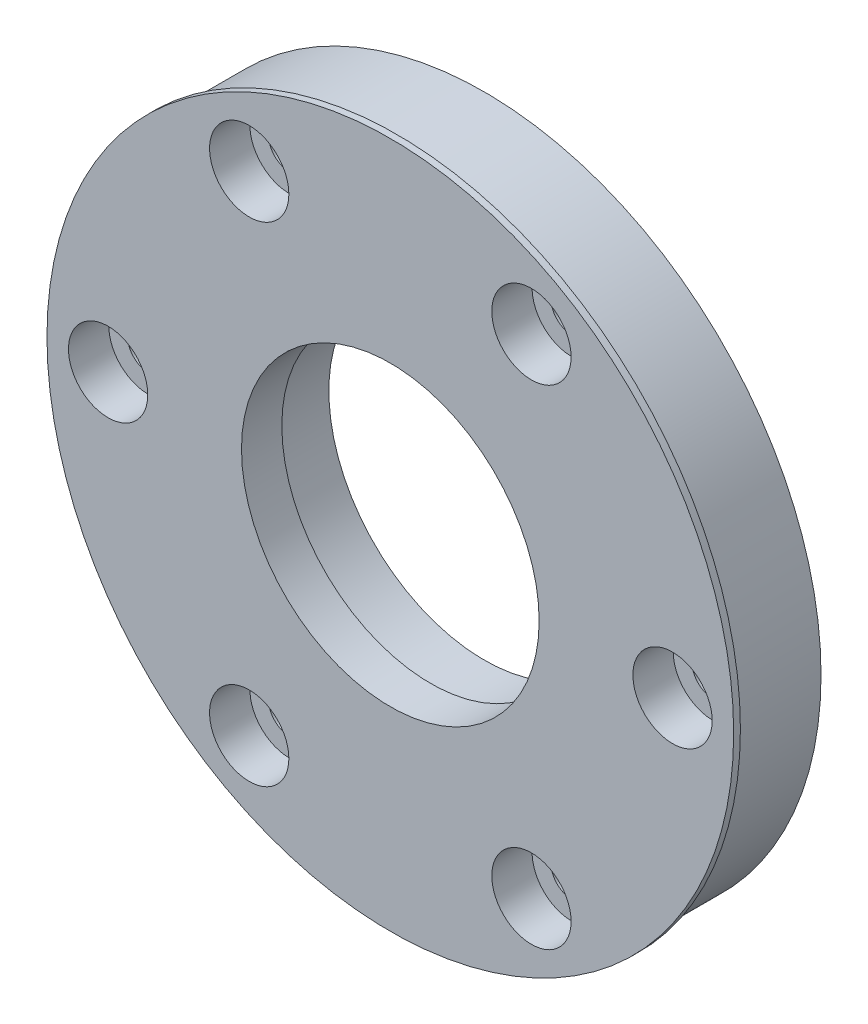
ISO-10303-21;
HEADER;
FILE_DESCRIPTION(('STEP AP214'),'2;1');
FILE_NAME('part.step','',(''),(''),'','','');
FILE_SCHEMA(('AUTOMOTIVE_DESIGN { 1 0 10303 214 1 1 1 1 }'));
ENDSEC;
DATA;
#1=APPLICATION_CONTEXT('core data for automotive mechanical design processes');
#2=APPLICATION_PROTOCOL_DEFINITION('international standard','automotive_design',2000,#1);
#3=PRODUCT_CONTEXT('',#1,'mechanical');
#4=PRODUCT('Part','Part','',(#3));
#5=PRODUCT_RELATED_PRODUCT_CATEGORY('part','',(#4));
#6=PRODUCT_DEFINITION_FORMATION('','',#4);
#7=PRODUCT_DEFINITION_CONTEXT('part definition',#1,'design');
#8=PRODUCT_DEFINITION('design','',#6,#7);
#9=PRODUCT_DEFINITION_SHAPE('','',#8);
#10=(LENGTH_UNIT() NAMED_UNIT(*) SI_UNIT(.MILLI.,.METRE.));
#11=(NAMED_UNIT(*) PLANE_ANGLE_UNIT() SI_UNIT($,.RADIAN.));
#12=(NAMED_UNIT(*) SI_UNIT($,.STERADIAN.) SOLID_ANGLE_UNIT());
#13=UNCERTAINTY_MEASURE_WITH_UNIT(LENGTH_MEASURE(1.E-05),#10,'distance_accuracy_value','');
#14=(GEOMETRIC_REPRESENTATION_CONTEXT(3) GLOBAL_UNCERTAINTY_ASSIGNED_CONTEXT((#13)) GLOBAL_UNIT_ASSIGNED_CONTEXT((#10,
#11,#12)) REPRESENTATION_CONTEXT('',''));
#15=CARTESIAN_POINT('',(0.,0.,0.));
#16=DIRECTION('',(0.,0.,1.));
#17=DIRECTION('',(1.,0.,0.));
#18=AXIS2_PLACEMENT_3D('',#15,#16,#17);
#19=CARTESIAN_POINT('',(0.,0.,0.));
#20=DIRECTION('',(0.,0.,1.));
#21=DIRECTION('',(1.,0.,0.));
#22=AXIS2_PLACEMENT_3D('',#19,#20,#21);
#23=CYLINDRICAL_SURFACE('',#22,11.575);
#24=CARTESIAN_POINT('',(0.,0.,0.));
#25=DIRECTION('',(0.,0.,1.));
#26=DIRECTION('',(1.,0.,0.));
#27=AXIS2_PLACEMENT_3D('',#24,#25,#26);
#28=CIRCLE('',#27,11.575);
#29=CARTESIAN_POINT('',(11.575,0.,0.));
#30=VERTEX_POINT('',#29);
#31=EDGE_CURVE('E200',#30,#30,#28,.T.);
#32=ORIENTED_EDGE('',*,*,#31,.F.);
#33=EDGE_LOOP('',(#32));
#34=FACE_BOUND('',#33,.T.);
#35=CARTESIAN_POINT('',(0.,0.,4.));
#36=DIRECTION('',(0.,0.,1.));
#37=DIRECTION('',(1.,0.,0.));
#38=AXIS2_PLACEMENT_3D('',#35,#36,#37);
#39=CIRCLE('',#38,11.575);
#40=CARTESIAN_POINT('',(11.575,0.,4.));
#41=VERTEX_POINT('',#40);
#42=EDGE_CURVE('E10',#41,#41,#39,.F.);
#43=ORIENTED_EDGE('',*,*,#42,.F.);
#44=EDGE_LOOP('',(#43));
#45=FACE_BOUND('',#44,.T.);
#46=ADVANCED_FACE('F43',(#34,#45),#23,.F.);
#47=CARTESIAN_POINT('',(10.5,18.1865334794732,7.));
#48=DIRECTION('',(0.,0.,-1.));
#49=DIRECTION('',(-1.,0.,0.));
#50=AXIS2_PLACEMENT_3D('',#47,#48,#49);
#51=CYLINDRICAL_SURFACE('',#50,1.55);
#52=CARTESIAN_POINT('',(10.5,18.1865334794732,4.));
#53=DIRECTION('',(0.,0.,1.));
#54=DIRECTION('',(1.,0.,0.));
#55=AXIS2_PLACEMENT_3D('',#52,#53,#54);
#56=CIRCLE('',#55,1.55);
#57=CARTESIAN_POINT('',(12.05,18.1865334794732,4.));
#58=VERTEX_POINT('',#57);
#59=EDGE_CURVE('E90',#58,#58,#56,.T.);
#60=ORIENTED_EDGE('',*,*,#59,.T.);
#61=EDGE_LOOP('',(#60));
#62=FACE_BOUND('',#61,.T.);
#63=CARTESIAN_POINT('',(10.5,18.1865334794732,1.7));
#64=DIRECTION('',(0.,0.,-1.));
#65=DIRECTION('',(-1.,0.,0.));
#66=AXIS2_PLACEMENT_3D('',#63,#64,#65);
#67=CIRCLE('',#66,1.55);
#68=CARTESIAN_POINT('',(8.95000000000001,18.1865334794732,1.7));
#69=VERTEX_POINT('',#68);
#70=EDGE_CURVE('E88',#69,#69,#67,.F.);
#71=ORIENTED_EDGE('',*,*,#70,.F.);
#72=EDGE_LOOP('',(#71));
#73=FACE_BOUND('',#72,.T.);
#74=ADVANCED_FACE('F265',(#62,#73),#51,.F.);
#75=CARTESIAN_POINT('',(-10.5,18.1865334794732,7.));
#76=DIRECTION('',(0.,0.,-1.));
#77=DIRECTION('',(-1.,0.,0.));
#78=AXIS2_PLACEMENT_3D('',#75,#76,#77);
#79=CYLINDRICAL_SURFACE('',#78,1.55);
#80=CARTESIAN_POINT('',(-10.5,18.1865334794732,4.));
#81=DIRECTION('',(0.,0.,1.));
#82=DIRECTION('',(1.,0.,0.));
#83=AXIS2_PLACEMENT_3D('',#80,#81,#82);
#84=CIRCLE('',#83,1.55);
#85=CARTESIAN_POINT('',(-8.95,18.1865334794732,4.));
#86=VERTEX_POINT('',#85);
#87=EDGE_CURVE('E94',#86,#86,#84,.T.);
#88=ORIENTED_EDGE('',*,*,#87,.T.);
#89=EDGE_LOOP('',(#88));
#90=FACE_BOUND('',#89,.T.);
#91=CARTESIAN_POINT('',(-10.5,18.1865334794732,1.7));
#92=DIRECTION('',(0.,0.,-1.));
#93=DIRECTION('',(-1.,0.,0.));
#94=AXIS2_PLACEMENT_3D('',#91,#92,#93);
#95=CIRCLE('',#94,1.55);
#96=CARTESIAN_POINT('',(-12.05,18.1865334794732,1.7));
#97=VERTEX_POINT('',#96);
#98=EDGE_CURVE('E86',#97,#97,#95,.F.);
#99=ORIENTED_EDGE('',*,*,#98,.F.);
#100=EDGE_LOOP('',(#99));
#101=FACE_BOUND('',#100,.T.);
#102=ADVANCED_FACE('F273',(#90,#101),#79,.F.);
#103=CARTESIAN_POINT('',(-21.,0.,7.));
#104=DIRECTION('',(0.,0.,-1.));
#105=DIRECTION('',(-1.,0.,0.));
#106=AXIS2_PLACEMENT_3D('',#103,#104,#105);
#107=CYLINDRICAL_SURFACE('',#106,1.55);
#108=CARTESIAN_POINT('',(-21.,0.,4.));
#109=DIRECTION('',(0.,0.,1.));
#110=DIRECTION('',(1.,0.,0.));
#111=AXIS2_PLACEMENT_3D('',#108,#109,#110);
#112=CIRCLE('',#111,1.55);
#113=CARTESIAN_POINT('',(-19.45,0.,4.));
#114=VERTEX_POINT('',#113);
#115=EDGE_CURVE('E99',#114,#114,#112,.T.);
#116=ORIENTED_EDGE('',*,*,#115,.T.);
#117=EDGE_LOOP('',(#116));
#118=FACE_BOUND('',#117,.T.);
#119=CARTESIAN_POINT('',(-21.,0.,1.7));
#120=DIRECTION('',(0.,0.,-1.));
#121=DIRECTION('',(-1.,0.,0.));
#122=AXIS2_PLACEMENT_3D('',#119,#120,#121);
#123=CIRCLE('',#122,1.55);
#124=CARTESIAN_POINT('',(-22.55,0.,1.7));
#125=VERTEX_POINT('',#124);
#126=EDGE_CURVE('E82',#125,#125,#123,.F.);
#127=ORIENTED_EDGE('',*,*,#126,.F.);
#128=EDGE_LOOP('',(#127));
#129=FACE_BOUND('',#128,.T.);
#130=ADVANCED_FACE('F414',(#118,#129),#107,.F.);
#131=CARTESIAN_POINT('',(-10.5,-18.1865334794732,7.));
#132=DIRECTION('',(0.,0.,-1.));
#133=DIRECTION('',(-1.,0.,0.));
#134=AXIS2_PLACEMENT_3D('',#131,#132,#133);
#135=CYLINDRICAL_SURFACE('',#134,1.55);
#136=CARTESIAN_POINT('',(-10.5,-18.1865334794732,4.));
#137=DIRECTION('',(0.,0.,1.));
#138=DIRECTION('',(1.,0.,0.));
#139=AXIS2_PLACEMENT_3D('',#136,#137,#138);
#140=CIRCLE('',#139,1.55);
#141=CARTESIAN_POINT('',(-8.95000000000001,-18.1865334794732,4.));
#142=VERTEX_POINT('',#141);
#143=EDGE_CURVE('E108',#142,#142,#140,.T.);
#144=ORIENTED_EDGE('',*,*,#143,.T.);
#145=EDGE_LOOP('',(#144));
#146=FACE_BOUND('',#145,.T.);
#147=CARTESIAN_POINT('',(-10.5,-18.1865334794732,1.7));
#148=DIRECTION('',(0.,0.,-1.));
#149=DIRECTION('',(-1.,0.,0.));
#150=AXIS2_PLACEMENT_3D('',#147,#148,#149);
#151=CIRCLE('',#150,1.55);
#152=CARTESIAN_POINT('',(-12.05,-18.1865334794732,1.7));
#153=VERTEX_POINT('',#152);
#154=EDGE_CURVE('E79',#153,#153,#151,.F.);
#155=ORIENTED_EDGE('',*,*,#154,.F.);
#156=EDGE_LOOP('',(#155));
#157=FACE_BOUND('',#156,.T.);
#158=ADVANCED_FACE('F422',(#146,#157),#135,.F.);
#159=CARTESIAN_POINT('',(10.5,-18.1865334794732,7.));
#160=DIRECTION('',(0.,0.,-1.));
#161=DIRECTION('',(-1.,0.,0.));
#162=AXIS2_PLACEMENT_3D('',#159,#160,#161);
#163=CYLINDRICAL_SURFACE('',#162,1.55);
#164=CARTESIAN_POINT('',(10.5,-18.1865334794732,4.));
#165=DIRECTION('',(0.,0.,1.));
#166=DIRECTION('',(1.,0.,0.));
#167=AXIS2_PLACEMENT_3D('',#164,#165,#166);
#168=CIRCLE('',#167,1.55);
#169=CARTESIAN_POINT('',(12.05,-18.1865334794732,4.));
#170=VERTEX_POINT('',#169);
#171=EDGE_CURVE('E111',#170,#170,#168,.T.);
#172=ORIENTED_EDGE('',*,*,#171,.T.);
#173=EDGE_LOOP('',(#172));
#174=FACE_BOUND('',#173,.T.);
#175=CARTESIAN_POINT('',(10.5,-18.1865334794732,1.7));
#176=DIRECTION('',(0.,0.,-1.));
#177=DIRECTION('',(-1.,0.,0.));
#178=AXIS2_PLACEMENT_3D('',#175,#176,#177);
#179=CIRCLE('',#178,1.55);
#180=CARTESIAN_POINT('',(8.94999999999999,-18.1865334794732,1.7));
#181=VERTEX_POINT('',#180);
#182=EDGE_CURVE('E74',#181,#181,#179,.F.);
#183=ORIENTED_EDGE('',*,*,#182,.F.);
#184=EDGE_LOOP('',(#183));
#185=FACE_BOUND('',#184,.T.);
#186=ADVANCED_FACE('F430',(#174,#185),#163,.F.);
#187=CARTESIAN_POINT('',(21.,0.,7.));
#188=DIRECTION('',(0.,0.,-1.));
#189=DIRECTION('',(-1.,0.,0.));
#190=AXIS2_PLACEMENT_3D('',#187,#188,#189);
#191=CYLINDRICAL_SURFACE('',#190,1.55);
#192=CARTESIAN_POINT('',(21.,0.,4.));
#193=DIRECTION('',(0.,0.,1.));
#194=DIRECTION('',(1.,0.,0.));
#195=AXIS2_PLACEMENT_3D('',#192,#193,#194);
#196=CIRCLE('',#195,1.55);
#197=CARTESIAN_POINT('',(22.55,0.,4.));
#198=VERTEX_POINT('',#197);
#199=EDGE_CURVE('E115',#198,#198,#196,.T.);
#200=ORIENTED_EDGE('',*,*,#199,.T.);
#201=EDGE_LOOP('',(#200));
#202=FACE_BOUND('',#201,.T.);
#203=CARTESIAN_POINT('',(21.,0.,1.7));
#204=DIRECTION('',(0.,0.,-1.));
#205=DIRECTION('',(-1.,0.,0.));
#206=AXIS2_PLACEMENT_3D('',#203,#204,#205);
#207=CIRCLE('',#206,1.55);
#208=CARTESIAN_POINT('',(19.45,0.,1.7));
#209=VERTEX_POINT('',#208);
#210=EDGE_CURVE('E70',#209,#209,#207,.F.);
#211=ORIENTED_EDGE('',*,*,#210,.F.);
#212=EDGE_LOOP('',(#211));
#213=FACE_BOUND('',#212,.T.);
#214=ADVANCED_FACE('F181',(#202,#213),#191,.F.);
#215=CARTESIAN_POINT('',(0.,0.,7.));
#216=DIRECTION('',(0.,0.,1.));
#217=DIRECTION('',(1.,0.,0.));
#218=AXIS2_PLACEMENT_3D('',#215,#216,#217);
#219=PLANE('',#218);
#220=CARTESIAN_POINT('',(-21.,1.46638343828664E-13,7.));
#221=DIRECTION('',(0.,0.,1.));
#222=DIRECTION('',(1.,0.,0.));
#223=AXIS2_PLACEMENT_3D('',#220,#221,#222);
#224=CIRCLE('',#223,2.95);
#225=CARTESIAN_POINT('',(-18.05,1.46638343828664E-13,7.));
#226=VERTEX_POINT('',#225);
#227=EDGE_CURVE('E129',#226,#226,#224,.T.);
#228=ORIENTED_EDGE('',*,*,#227,.F.);
#229=EDGE_LOOP('',(#228));
#230=FACE_BOUND('',#229,.T.);
#231=CARTESIAN_POINT('',(-10.5000000000003,-18.186533479473,7.));
#232=DIRECTION('',(0.,0.,1.));
#233=DIRECTION('',(1.,0.,0.));
#234=AXIS2_PLACEMENT_3D('',#231,#232,#233);
#235=CIRCLE('',#234,2.95);
#236=CARTESIAN_POINT('',(-7.55000000000034,-18.186533479473,7.));
#237=VERTEX_POINT('',#236);
#238=EDGE_CURVE('E134',#237,#237,#235,.T.);
#239=ORIENTED_EDGE('',*,*,#238,.F.);
#240=EDGE_LOOP('',(#239));
#241=FACE_BOUND('',#240,.T.);
#242=CARTESIAN_POINT('',(10.5000000000001,-18.1865334794728,7.));
#243=DIRECTION('',(0.,0.,1.));
#244=DIRECTION('',(1.,0.,0.));
#245=AXIS2_PLACEMENT_3D('',#242,#243,#244);
#246=CIRCLE('',#245,2.95);
#247=CARTESIAN_POINT('',(13.4500000000001,-18.1865334794728,7.));
#248=VERTEX_POINT('',#247);
#249=EDGE_CURVE('E161',#248,#248,#246,.T.);
#250=ORIENTED_EDGE('',*,*,#249,.F.);
#251=EDGE_LOOP('',(#250));
#252=FACE_BOUND('',#251,.T.);
#253=CARTESIAN_POINT('',(21.,-1.44066585550455E-13,7.));
#254=DIRECTION('',(0.,0.,1.));
#255=DIRECTION('',(1.,0.,0.));
#256=AXIS2_PLACEMENT_3D('',#253,#254,#255);
#257=CIRCLE('',#256,2.95);
#258=CARTESIAN_POINT('',(23.95,-1.44066585550455E-13,7.));
#259=VERTEX_POINT('',#258);
#260=EDGE_CURVE('E153',#259,#259,#257,.T.);
#261=ORIENTED_EDGE('',*,*,#260,.F.);
#262=EDGE_LOOP('',(#261));
#263=FACE_BOUND('',#262,.T.);
#264=CARTESIAN_POINT('',(10.4999999999999,18.1865334794736,7.));
#265=DIRECTION('',(0.,0.,1.));
#266=DIRECTION('',(1.,0.,0.));
#267=AXIS2_PLACEMENT_3D('',#264,#265,#266);
#268=CIRCLE('',#267,2.95);
#269=CARTESIAN_POINT('',(13.4499999999999,18.1865334794736,7.));
#270=VERTEX_POINT('',#269);
#271=EDGE_CURVE('E147',#270,#270,#268,.T.);
#272=ORIENTED_EDGE('',*,*,#271,.F.);
#273=EDGE_LOOP('',(#272));
#274=FACE_BOUND('',#273,.T.);
#275=CARTESIAN_POINT('',(-10.4999999999998,18.1865334794733,7.));
#276=DIRECTION('',(0.,0.,1.));
#277=DIRECTION('',(1.,0.,0.));
#278=AXIS2_PLACEMENT_3D('',#275,#276,#277);
#279=CIRCLE('',#278,2.95);
#280=CARTESIAN_POINT('',(-7.54999999999983,18.1865334794733,7.));
#281=VERTEX_POINT('',#280);
#282=EDGE_CURVE('E133',#281,#281,#279,.T.);
#283=ORIENTED_EDGE('',*,*,#282,.F.);
#284=EDGE_LOOP('',(#283));
#285=FACE_BOUND('',#284,.T.);
#286=CARTESIAN_POINT('',(0.,0.,7.));
#287=DIRECTION('',(0.,0.,1.));
#288=DIRECTION('',(1.,0.,0.));
#289=AXIS2_PLACEMENT_3D('',#286,#287,#288);
#290=CIRCLE('',#289,25.55);
#291=CARTESIAN_POINT('',(25.55,0.,7.));
#292=VERTEX_POINT('',#291);
#293=EDGE_CURVE('E119',#292,#292,#290,.T.);
#294=ORIENTED_EDGE('',*,*,#293,.T.);
#295=EDGE_LOOP('',(#294));
#296=FACE_BOUND('',#295,.T.);
#297=CARTESIAN_POINT('',(0.,0.,7.));
#298=DIRECTION('',(0.,0.,1.));
#299=DIRECTION('',(1.,0.,0.));
#300=AXIS2_PLACEMENT_3D('',#297,#298,#299);
#301=CIRCLE('',#300,11.075);
#302=CARTESIAN_POINT('',(11.075,0.,7.));
#303=VERTEX_POINT('',#302);
#304=EDGE_CURVE('E194',#303,#303,#301,.T.);
#305=ORIENTED_EDGE('',*,*,#304,.F.);
#306=EDGE_LOOP('',(#305));
#307=FACE_BOUND('',#306,.T.);
#308=ADVANCED_FACE('F177',(#230,#241,#252,#263,#274,#285,#296,#307),#219,.T.);
#309=CARTESIAN_POINT('',(-10.4999999999998,18.1865334794733,4.));
#310=DIRECTION('',(0.,0.,1.));
#311=DIRECTION('',(1.,0.,0.));
#312=AXIS2_PLACEMENT_3D('',#309,#310,#311);
#313=CYLINDRICAL_SURFACE('',#312,2.95);
#314=CARTESIAN_POINT('',(-10.4999999999998,18.1865334794733,4.));
#315=DIRECTION('',(0.,0.,1.));
#316=DIRECTION('',(1.,0.,0.));
#317=AXIS2_PLACEMENT_3D('',#314,#315,#316);
#318=CIRCLE('',#317,2.95);
#319=CARTESIAN_POINT('',(-7.54999999999983,18.1865334794733,4.));
#320=VERTEX_POINT('',#319);
#321=EDGE_CURVE('E143',#320,#320,#318,.T.);
#322=ORIENTED_EDGE('',*,*,#321,.F.);
#323=EDGE_LOOP('',(#322));
#324=FACE_BOUND('',#323,.T.);
#325=ORIENTED_EDGE('',*,*,#282,.T.);
#326=EDGE_LOOP('',(#325));
#327=FACE_BOUND('',#326,.T.);
#328=ADVANCED_FACE('F180',(#324,#327),#313,.F.);
#329=CARTESIAN_POINT('',(-10.4999999999998,18.1865334794733,4.));
#330=DIRECTION('',(0.,0.,1.));
#331=DIRECTION('',(1.,0.,0.));
#332=AXIS2_PLACEMENT_3D('',#329,#330,#331);
#333=PLANE('',#332);
#334=ORIENTED_EDGE('',*,*,#87,.F.);
#335=EDGE_LOOP('',(#334));
#336=FACE_BOUND('',#335,.T.);
#337=ORIENTED_EDGE('',*,*,#321,.T.);
#338=EDGE_LOOP('',(#337));
#339=FACE_BOUND('',#338,.T.);
#340=ADVANCED_FACE('F344',(#336,#339),#333,.T.);
#341=CARTESIAN_POINT('',(10.4999999999999,18.1865334794736,4.));
#342=DIRECTION('',(0.,0.,1.));
#343=DIRECTION('',(1.,0.,0.));
#344=AXIS2_PLACEMENT_3D('',#341,#342,#343);
#345=CYLINDRICAL_SURFACE('',#344,2.95);
#346=CARTESIAN_POINT('',(10.4999999999999,18.1865334794736,4.));
#347=DIRECTION('',(0.,0.,1.));
#348=DIRECTION('',(1.,0.,0.));
#349=AXIS2_PLACEMENT_3D('',#346,#347,#348);
#350=CIRCLE('',#349,2.95);
#351=CARTESIAN_POINT('',(13.4499999999999,18.1865334794736,4.));
#352=VERTEX_POINT('',#351);
#353=EDGE_CURVE('E150',#352,#352,#350,.T.);
#354=ORIENTED_EDGE('',*,*,#353,.F.);
#355=EDGE_LOOP('',(#354));
#356=FACE_BOUND('',#355,.T.);
#357=ORIENTED_EDGE('',*,*,#271,.T.);
#358=EDGE_LOOP('',(#357));
#359=FACE_BOUND('',#358,.T.);
#360=ADVANCED_FACE('F348',(#356,#359),#345,.F.);
#361=CARTESIAN_POINT('',(10.4999999999999,18.1865334794736,4.));
#362=DIRECTION('',(0.,0.,1.));
#363=DIRECTION('',(1.,0.,0.));
#364=AXIS2_PLACEMENT_3D('',#361,#362,#363);
#365=PLANE('',#364);
#366=ORIENTED_EDGE('',*,*,#59,.F.);
#367=EDGE_LOOP('',(#366));
#368=FACE_BOUND('',#367,.T.);
#369=ORIENTED_EDGE('',*,*,#353,.T.);
#370=EDGE_LOOP('',(#369));
#371=FACE_BOUND('',#370,.T.);
#372=ADVANCED_FACE('F356',(#368,#371),#365,.T.);
#373=CARTESIAN_POINT('',(21.,-1.44066585550455E-13,4.));
#374=DIRECTION('',(0.,0.,1.));
#375=DIRECTION('',(1.,0.,0.));
#376=AXIS2_PLACEMENT_3D('',#373,#374,#375);
#377=CYLINDRICAL_SURFACE('',#376,2.95);
#378=CARTESIAN_POINT('',(21.,-1.44066585550455E-13,4.));
#379=DIRECTION('',(0.,0.,1.));
#380=DIRECTION('',(1.,0.,0.));
#381=AXIS2_PLACEMENT_3D('',#378,#379,#380);
#382=CIRCLE('',#381,2.95);
#383=CARTESIAN_POINT('',(23.95,-1.44066585550455E-13,4.));
#384=VERTEX_POINT('',#383);
#385=EDGE_CURVE('E157',#384,#384,#382,.T.);
#386=ORIENTED_EDGE('',*,*,#385,.F.);
#387=EDGE_LOOP('',(#386));
#388=FACE_BOUND('',#387,.T.);
#389=ORIENTED_EDGE('',*,*,#260,.T.);
#390=EDGE_LOOP('',(#389));
#391=FACE_BOUND('',#390,.T.);
#392=ADVANCED_FACE('F360',(#388,#391),#377,.F.);
#393=CARTESIAN_POINT('',(21.,-1.44066585550455E-13,4.));
#394=DIRECTION('',(0.,0.,1.));
#395=DIRECTION('',(1.,0.,0.));
#396=AXIS2_PLACEMENT_3D('',#393,#394,#395);
#397=PLANE('',#396);
#398=ORIENTED_EDGE('',*,*,#199,.F.);
#399=EDGE_LOOP('',(#398));
#400=FACE_BOUND('',#399,.T.);
#401=ORIENTED_EDGE('',*,*,#385,.T.);
#402=EDGE_LOOP('',(#401));
#403=FACE_BOUND('',#402,.T.);
#404=ADVANCED_FACE('F173',(#400,#403),#397,.T.);
#405=CARTESIAN_POINT('',(10.5000000000001,-18.1865334794728,4.));
#406=DIRECTION('',(0.,0.,1.));
#407=DIRECTION('',(1.,0.,0.));
#408=AXIS2_PLACEMENT_3D('',#405,#406,#407);
#409=CYLINDRICAL_SURFACE('',#408,2.95);
#410=CARTESIAN_POINT('',(10.5000000000001,-18.1865334794728,4.));
#411=DIRECTION('',(0.,0.,1.));
#412=DIRECTION('',(1.,0.,0.));
#413=AXIS2_PLACEMENT_3D('',#410,#411,#412);
#414=CIRCLE('',#413,2.95);
#415=CARTESIAN_POINT('',(13.4500000000001,-18.1865334794728,4.));
#416=VERTEX_POINT('',#415);
#417=EDGE_CURVE('E137',#416,#416,#414,.T.);
#418=ORIENTED_EDGE('',*,*,#417,.F.);
#419=EDGE_LOOP('',(#418));
#420=FACE_BOUND('',#419,.T.);
#421=ORIENTED_EDGE('',*,*,#249,.T.);
#422=EDGE_LOOP('',(#421));
#423=FACE_BOUND('',#422,.T.);
#424=ADVANCED_FACE('F170',(#420,#423),#409,.F.);
#425=CARTESIAN_POINT('',(10.5000000000001,-18.1865334794728,4.));
#426=DIRECTION('',(0.,0.,1.));
#427=DIRECTION('',(1.,0.,0.));
#428=AXIS2_PLACEMENT_3D('',#425,#426,#427);
#429=PLANE('',#428);
#430=ORIENTED_EDGE('',*,*,#171,.F.);
#431=EDGE_LOOP('',(#430));
#432=FACE_BOUND('',#431,.T.);
#433=ORIENTED_EDGE('',*,*,#417,.T.);
#434=EDGE_LOOP('',(#433));
#435=FACE_BOUND('',#434,.T.);
#436=ADVANCED_FACE('F168',(#432,#435),#429,.T.);
#437=CARTESIAN_POINT('',(-10.5000000000003,-18.186533479473,4.));
#438=DIRECTION('',(0.,0.,1.));
#439=DIRECTION('',(1.,0.,0.));
#440=AXIS2_PLACEMENT_3D('',#437,#438,#439);
#441=CYLINDRICAL_SURFACE('',#440,2.95);
#442=CARTESIAN_POINT('',(-10.5000000000003,-18.186533479473,4.));
#443=DIRECTION('',(0.,0.,1.));
#444=DIRECTION('',(1.,0.,0.));
#445=AXIS2_PLACEMENT_3D('',#442,#443,#444);
#446=CIRCLE('',#445,2.95);
#447=CARTESIAN_POINT('',(-7.55000000000034,-18.186533479473,4.));
#448=VERTEX_POINT('',#447);
#449=EDGE_CURVE('E123',#448,#448,#446,.T.);
#450=ORIENTED_EDGE('',*,*,#449,.F.);
#451=EDGE_LOOP('',(#450));
#452=FACE_BOUND('',#451,.T.);
#453=ORIENTED_EDGE('',*,*,#238,.T.);
#454=EDGE_LOOP('',(#453));
#455=FACE_BOUND('',#454,.T.);
#456=ADVANCED_FACE('F379',(#452,#455),#441,.F.);
#457=CARTESIAN_POINT('',(-10.5000000000003,-18.186533479473,4.));
#458=DIRECTION('',(0.,0.,1.));
#459=DIRECTION('',(1.,0.,0.));
#460=AXIS2_PLACEMENT_3D('',#457,#458,#459);
#461=PLANE('',#460);
#462=ORIENTED_EDGE('',*,*,#143,.F.);
#463=EDGE_LOOP('',(#462));
#464=FACE_BOUND('',#463,.T.);
#465=ORIENTED_EDGE('',*,*,#449,.T.);
#466=EDGE_LOOP('',(#465));
#467=FACE_BOUND('',#466,.T.);
#468=ADVANCED_FACE('F386',(#464,#467),#461,.T.);
#469=CARTESIAN_POINT('',(-21.,1.46638343828664E-13,4.));
#470=DIRECTION('',(0.,0.,1.));
#471=DIRECTION('',(1.,0.,0.));
#472=AXIS2_PLACEMENT_3D('',#469,#470,#471);
#473=CYLINDRICAL_SURFACE('',#472,2.95);
#474=CARTESIAN_POINT('',(-21.,1.46638343828664E-13,4.));
#475=DIRECTION('',(0.,0.,1.));
#476=DIRECTION('',(1.,0.,0.));
#477=AXIS2_PLACEMENT_3D('',#474,#475,#476);
#478=CIRCLE('',#477,2.95);
#479=CARTESIAN_POINT('',(-18.05,1.46638343828664E-13,4.));
#480=VERTEX_POINT('',#479);
#481=EDGE_CURVE('E66',#480,#480,#478,.T.);
#482=ORIENTED_EDGE('',*,*,#481,.F.);
#483=EDGE_LOOP('',(#482));
#484=FACE_BOUND('',#483,.T.);
#485=ORIENTED_EDGE('',*,*,#227,.T.);
#486=EDGE_LOOP('',(#485));
#487=FACE_BOUND('',#486,.T.);
#488=ADVANCED_FACE('F390',(#484,#487),#473,.F.);
#489=CARTESIAN_POINT('',(-21.,1.46638343828664E-13,4.));
#490=DIRECTION('',(0.,0.,1.));
#491=DIRECTION('',(1.,0.,0.));
#492=AXIS2_PLACEMENT_3D('',#489,#490,#491);
#493=PLANE('',#492);
#494=ORIENTED_EDGE('',*,*,#115,.F.);
#495=EDGE_LOOP('',(#494));
#496=FACE_BOUND('',#495,.T.);
#497=ORIENTED_EDGE('',*,*,#481,.T.);
#498=EDGE_LOOP('',(#497));
#499=FACE_BOUND('',#498,.T.);
#500=ADVANCED_FACE('F397',(#496,#499),#493,.T.);
#501=CARTESIAN_POINT('',(0.,0.,6.5));
#502=DIRECTION('',(0.,0.,1.));
#503=DIRECTION('',(1.,0.,0.));
#504=AXIS2_PLACEMENT_3D('',#501,#502,#503);
#505=CYLINDRICAL_SURFACE('',#504,25.55);
#506=CARTESIAN_POINT('',(0.,0.,6.5));
#507=DIRECTION('',(0.,0.,1.));
#508=DIRECTION('',(1.,0.,0.));
#509=AXIS2_PLACEMENT_3D('',#506,#507,#508);
#510=CIRCLE('',#509,25.55);
#511=CARTESIAN_POINT('',(25.55,0.,6.5));
#512=VERTEX_POINT('',#511);
#513=EDGE_CURVE('E120',#512,#512,#510,.T.);
#514=ORIENTED_EDGE('',*,*,#513,.T.);
#515=EDGE_LOOP('',(#514));
#516=FACE_BOUND('',#515,.T.);
#517=ORIENTED_EDGE('',*,*,#293,.F.);
#518=EDGE_LOOP('',(#517));
#519=FACE_BOUND('',#518,.T.);
#520=ADVANCED_FACE('F400',(#516,#519),#505,.T.);
#521=CARTESIAN_POINT('',(0.,0.,6.5));
#522=DIRECTION('',(0.,0.,1.));
#523=DIRECTION('',(1.,0.,0.));
#524=AXIS2_PLACEMENT_3D('',#521,#522,#523);
#525=PLANE('',#524);
#526=CARTESIAN_POINT('',(0.,0.,6.5));
#527=DIRECTION('',(0.,0.,1.));
#528=DIRECTION('',(1.,0.,0.));
#529=AXIS2_PLACEMENT_3D('',#526,#527,#528);
#530=CIRCLE('',#529,25.05);
#531=CARTESIAN_POINT('',(25.05,0.,6.5));
#532=VERTEX_POINT('',#531);
#533=EDGE_CURVE('E51',#532,#532,#530,.T.);
#534=ORIENTED_EDGE('',*,*,#533,.T.);
#535=EDGE_LOOP('',(#534));
#536=FACE_BOUND('',#535,.T.);
#537=ORIENTED_EDGE('',*,*,#513,.F.);
#538=EDGE_LOOP('',(#537));
#539=FACE_BOUND('',#538,.T.);
#540=ADVANCED_FACE('F323',(#536,#539),#525,.F.);
#541=CARTESIAN_POINT('',(0.,0.,0.));
#542=DIRECTION('',(0.,0.,1.));
#543=DIRECTION('',(1.,0.,0.));
#544=AXIS2_PLACEMENT_3D('',#541,#542,#543);
#545=PLANE('',#544);
#546=ORIENTED_EDGE('',*,*,#31,.T.);
#547=EDGE_LOOP('',(#546));
#548=FACE_BOUND('',#547,.T.);
#549=CARTESIAN_POINT('',(21.,0.,0.));
#550=DIRECTION('',(0.,0.,-1.));
#551=DIRECTION('',(-1.,0.,0.));
#552=AXIS2_PLACEMENT_3D('',#549,#550,#551);
#553=CIRCLE('',#552,3.);
#554=CARTESIAN_POINT('',(18.,0.,0.));
#555=VERTEX_POINT('',#554);
#556=EDGE_CURVE('E209',#555,#555,#553,.T.);
#557=ORIENTED_EDGE('',*,*,#556,.F.);
#558=EDGE_LOOP('',(#557));
#559=FACE_BOUND('',#558,.T.);
#560=CARTESIAN_POINT('',(10.5000000000002,-18.1865334794731,0.));
#561=DIRECTION('',(0.,0.,-1.));
#562=DIRECTION('',(-1.,0.,0.));
#563=AXIS2_PLACEMENT_3D('',#560,#561,#562);
#564=CIRCLE('',#563,3.);
#565=CARTESIAN_POINT('',(7.50000000000022,-18.1865334794731,0.));
#566=VERTEX_POINT('',#565);
#567=EDGE_CURVE('E214',#566,#566,#564,.T.);
#568=ORIENTED_EDGE('',*,*,#567,.F.);
#569=EDGE_LOOP('',(#568));
#570=FACE_BOUND('',#569,.T.);
#571=CARTESIAN_POINT('',(-10.4999999999998,-18.1865334794733,0.));
#572=DIRECTION('',(0.,0.,-1.));
#573=DIRECTION('',(-1.,0.,0.));
#574=AXIS2_PLACEMENT_3D('',#571,#572,#573);
#575=CIRCLE('',#574,3.);
#576=CARTESIAN_POINT('',(-13.4999999999998,-18.1865334794733,0.));
#577=VERTEX_POINT('',#576);
#578=EDGE_CURVE('E241',#577,#577,#575,.T.);
#579=ORIENTED_EDGE('',*,*,#578,.F.);
#580=EDGE_LOOP('',(#579));
#581=FACE_BOUND('',#580,.T.);
#582=CARTESIAN_POINT('',(-21.,-1.4658413372004E-13,0.));
#583=DIRECTION('',(0.,0.,-1.));
#584=DIRECTION('',(-1.,0.,0.));
#585=AXIS2_PLACEMENT_3D('',#582,#583,#584);
#586=CIRCLE('',#585,3.);
#587=CARTESIAN_POINT('',(-24.,-1.4658413372004E-13,0.));
#588=VERTEX_POINT('',#587);
#589=EDGE_CURVE('E234',#588,#588,#586,.T.);
#590=ORIENTED_EDGE('',*,*,#589,.F.);
#591=EDGE_LOOP('',(#590));
#592=FACE_BOUND('',#591,.T.);
#593=CARTESIAN_POINT('',(-10.5000000000001,18.1865334794732,0.));
#594=DIRECTION('',(0.,0.,-1.));
#595=DIRECTION('',(-1.,0.,0.));
#596=AXIS2_PLACEMENT_3D('',#593,#594,#595);
#597=CIRCLE('',#596,3.);
#598=CARTESIAN_POINT('',(-13.5000000000001,18.1865334794732,0.));
#599=VERTEX_POINT('',#598);
#600=EDGE_CURVE('E226',#599,#599,#597,.T.);
#601=ORIENTED_EDGE('',*,*,#600,.F.);
#602=EDGE_LOOP('',(#601));
#603=FACE_BOUND('',#602,.T.);
#604=CARTESIAN_POINT('',(10.5,18.1865334794732,0.));
#605=DIRECTION('',(0.,0.,-1.));
#606=DIRECTION('',(-1.,0.,0.));
#607=AXIS2_PLACEMENT_3D('',#604,#605,#606);
#608=CIRCLE('',#607,3.);
#609=CARTESIAN_POINT('',(7.49999999999996,18.1865334794732,0.));
#610=VERTEX_POINT('',#609);
#611=EDGE_CURVE('E213',#610,#610,#608,.T.);
#612=ORIENTED_EDGE('',*,*,#611,.F.);
#613=EDGE_LOOP('',(#612));
#614=FACE_BOUND('',#613,.T.);
#615=CARTESIAN_POINT('',(0.,0.,0.));
#616=DIRECTION('',(0.,0.,1.));
#617=DIRECTION('',(1.,0.,0.));
#618=AXIS2_PLACEMENT_3D('',#615,#616,#617);
#619=CIRCLE('',#618,25.05);
#620=CARTESIAN_POINT('',(25.05,0.,0.));
#621=VERTEX_POINT('',#620);
#622=EDGE_CURVE('E58',#621,#621,#619,.T.);
#623=ORIENTED_EDGE('',*,*,#622,.F.);
#624=EDGE_LOOP('',(#623));
#625=FACE_BOUND('',#624,.T.);
#626=ADVANCED_FACE('F320',(#548,#559,#570,#581,#592,#603,#614,#625),#545,.F.);
#627=CARTESIAN_POINT('',(0.,0.,7.));
#628=DIRECTION('',(0.,0.,-1.));
#629=DIRECTION('',(-1.,0.,0.));
#630=AXIS2_PLACEMENT_3D('',#627,#628,#629);
#631=CYLINDRICAL_SURFACE('',#630,25.05);
#632=ORIENTED_EDGE('',*,*,#622,.T.);
#633=EDGE_LOOP('',(#632));
#634=FACE_BOUND('',#633,.T.);
#635=ORIENTED_EDGE('',*,*,#533,.F.);
#636=EDGE_LOOP('',(#635));
#637=FACE_BOUND('',#636,.T.);
#638=ADVANCED_FACE('F45',(#634,#637),#631,.T.);
#639=CARTESIAN_POINT('',(21.,0.,1.7));
#640=DIRECTION('',(0.,0.,-1.));
#641=DIRECTION('',(-1.,0.,0.));
#642=AXIS2_PLACEMENT_3D('',#639,#640,#641);
#643=PLANE('',#642);
#644=CARTESIAN_POINT('',(21.,0.,1.7));
#645=DIRECTION('',(0.,0.,-1.));
#646=DIRECTION('',(-1.,0.,0.));
#647=AXIS2_PLACEMENT_3D('',#644,#645,#646);
#648=CIRCLE('',#647,3.);
#649=CARTESIAN_POINT('',(18.,0.,1.7));
#650=VERTEX_POINT('',#649);
#651=EDGE_CURVE('E75',#650,#650,#648,.T.);
#652=ORIENTED_EDGE('',*,*,#651,.T.);
#653=EDGE_LOOP('',(#652));
#654=FACE_BOUND('',#653,.T.);
#655=ORIENTED_EDGE('',*,*,#210,.T.);
#656=EDGE_LOOP('',(#655));
#657=FACE_BOUND('',#656,.T.);
#658=ADVANCED_FACE('F281',(#654,#657),#643,.T.);
#659=CARTESIAN_POINT('',(21.,0.,1.7));
#660=DIRECTION('',(0.,0.,-1.));
#661=DIRECTION('',(-1.,0.,0.));
#662=AXIS2_PLACEMENT_3D('',#659,#660,#661);
#663=CYLINDRICAL_SURFACE('',#662,3.);
#664=ORIENTED_EDGE('',*,*,#651,.F.);
#665=EDGE_LOOP('',(#664));
#666=FACE_BOUND('',#665,.T.);
#667=ORIENTED_EDGE('',*,*,#556,.T.);
#668=EDGE_LOOP('',(#667));
#669=FACE_BOUND('',#668,.T.);
#670=ADVANCED_FACE('F284',(#666,#669),#663,.F.);
#671=CARTESIAN_POINT('',(10.5000000000002,-18.1865334794731,1.7));
#672=DIRECTION('',(0.,0.,-1.));
#673=DIRECTION('',(-1.,0.,0.));
#674=AXIS2_PLACEMENT_3D('',#671,#672,#673);
#675=PLANE('',#674);
#676=CARTESIAN_POINT('',(10.5000000000002,-18.1865334794731,1.7));
#677=DIRECTION('',(0.,0.,-1.));
#678=DIRECTION('',(-1.,0.,0.));
#679=AXIS2_PLACEMENT_3D('',#676,#677,#678);
#680=CIRCLE('',#679,3.);
#681=CARTESIAN_POINT('',(7.50000000000022,-18.1865334794731,1.7));
#682=VERTEX_POINT('',#681);
#683=EDGE_CURVE('E205',#682,#682,#680,.T.);
#684=ORIENTED_EDGE('',*,*,#683,.T.);
#685=EDGE_LOOP('',(#684));
#686=FACE_BOUND('',#685,.T.);
#687=ORIENTED_EDGE('',*,*,#182,.T.);
#688=EDGE_LOOP('',(#687));
#689=FACE_BOUND('',#688,.T.);
#690=ADVANCED_FACE('F288',(#686,#689),#675,.T.);
#691=CARTESIAN_POINT('',(10.5000000000002,-18.1865334794731,1.7));
#692=DIRECTION('',(0.,0.,-1.));
#693=DIRECTION('',(-1.,0.,0.));
#694=AXIS2_PLACEMENT_3D('',#691,#692,#693);
#695=CYLINDRICAL_SURFACE('',#694,3.);
#696=ORIENTED_EDGE('',*,*,#683,.F.);
#697=EDGE_LOOP('',(#696));
#698=FACE_BOUND('',#697,.T.);
#699=ORIENTED_EDGE('',*,*,#567,.T.);
#700=EDGE_LOOP('',(#699));
#701=FACE_BOUND('',#700,.T.);
#702=ADVANCED_FACE('F262',(#698,#701),#695,.F.);
#703=CARTESIAN_POINT('',(-10.4999999999998,-18.1865334794733,1.7));
#704=DIRECTION('',(0.,0.,-1.));
#705=DIRECTION('',(-1.,0.,0.));
#706=AXIS2_PLACEMENT_3D('',#703,#704,#705);
#707=PLANE('',#706);
#708=CARTESIAN_POINT('',(-10.4999999999998,-18.1865334794733,1.7));
#709=DIRECTION('',(0.,0.,-1.));
#710=DIRECTION('',(-1.,0.,0.));
#711=AXIS2_PLACEMENT_3D('',#708,#709,#710);
#712=CIRCLE('',#711,3.);
#713=CARTESIAN_POINT('',(-13.4999999999998,-18.1865334794733,1.7));
#714=VERTEX_POINT('',#713);
#715=EDGE_CURVE('E102',#714,#714,#712,.T.);
#716=ORIENTED_EDGE('',*,*,#715,.T.);
#717=EDGE_LOOP('',(#716));
#718=FACE_BOUND('',#717,.T.);
#719=ORIENTED_EDGE('',*,*,#154,.T.);
#720=EDGE_LOOP('',(#719));
#721=FACE_BOUND('',#720,.T.);
#722=ADVANCED_FACE('F248',(#718,#721),#707,.T.);
#723=CARTESIAN_POINT('',(-10.4999999999998,-18.1865334794733,1.7));
#724=DIRECTION('',(0.,0.,-1.));
#725=DIRECTION('',(-1.,0.,0.));
#726=AXIS2_PLACEMENT_3D('',#723,#724,#725);
#727=CYLINDRICAL_SURFACE('',#726,3.);
#728=ORIENTED_EDGE('',*,*,#715,.F.);
#729=EDGE_LOOP('',(#728));
#730=FACE_BOUND('',#729,.T.);
#731=ORIENTED_EDGE('',*,*,#578,.T.);
#732=EDGE_LOOP('',(#731));
#733=FACE_BOUND('',#732,.T.);
#734=ADVANCED_FACE('F251',(#730,#733),#727,.F.);
#735=CARTESIAN_POINT('',(-21.,-1.4658413372004E-13,1.7));
#736=DIRECTION('',(0.,0.,-1.));
#737=DIRECTION('',(-1.,0.,0.));
#738=AXIS2_PLACEMENT_3D('',#735,#736,#737);
#739=PLANE('',#738);
#740=CARTESIAN_POINT('',(-21.,-1.4658413372004E-13,1.7));
#741=DIRECTION('',(0.,0.,-1.));
#742=DIRECTION('',(-1.,0.,0.));
#743=AXIS2_PLACEMENT_3D('',#740,#741,#742);
#744=CIRCLE('',#743,3.);
#745=CARTESIAN_POINT('',(-24.,-1.4658413372004E-13,1.7));
#746=VERTEX_POINT('',#745);
#747=EDGE_CURVE('E238',#746,#746,#744,.T.);
#748=ORIENTED_EDGE('',*,*,#747,.T.);
#749=EDGE_LOOP('',(#748));
#750=FACE_BOUND('',#749,.T.);
#751=ORIENTED_EDGE('',*,*,#126,.T.);
#752=EDGE_LOOP('',(#751));
#753=FACE_BOUND('',#752,.T.);
#754=ADVANCED_FACE('F253',(#750,#753),#739,.T.);
#755=CARTESIAN_POINT('',(-21.,-1.4658413372004E-13,1.7));
#756=DIRECTION('',(0.,0.,-1.));
#757=DIRECTION('',(-1.,0.,0.));
#758=AXIS2_PLACEMENT_3D('',#755,#756,#757);
#759=CYLINDRICAL_SURFACE('',#758,3.);
#760=ORIENTED_EDGE('',*,*,#747,.F.);
#761=EDGE_LOOP('',(#760));
#762=FACE_BOUND('',#761,.T.);
#763=ORIENTED_EDGE('',*,*,#589,.T.);
#764=EDGE_LOOP('',(#763));
#765=FACE_BOUND('',#764,.T.);
#766=ADVANCED_FACE('F259',(#762,#765),#759,.F.);
#767=CARTESIAN_POINT('',(-10.5000000000001,18.1865334794732,1.7));
#768=DIRECTION('',(0.,0.,-1.));
#769=DIRECTION('',(-1.,0.,0.));
#770=AXIS2_PLACEMENT_3D('',#767,#768,#769);
#771=PLANE('',#770);
#772=CARTESIAN_POINT('',(-10.5000000000001,18.1865334794732,1.7));
#773=DIRECTION('',(0.,0.,-1.));
#774=DIRECTION('',(-1.,0.,0.));
#775=AXIS2_PLACEMENT_3D('',#772,#773,#774);
#776=CIRCLE('',#775,3.);
#777=CARTESIAN_POINT('',(-13.5000000000001,18.1865334794732,1.7));
#778=VERTEX_POINT('',#777);
#779=EDGE_CURVE('E230',#778,#778,#776,.T.);
#780=ORIENTED_EDGE('',*,*,#779,.T.);
#781=EDGE_LOOP('',(#780));
#782=FACE_BOUND('',#781,.T.);
#783=ORIENTED_EDGE('',*,*,#98,.T.);
#784=EDGE_LOOP('',(#783));
#785=FACE_BOUND('',#784,.T.);
#786=ADVANCED_FACE('F307',(#782,#785),#771,.T.);
#787=CARTESIAN_POINT('',(-10.5000000000001,18.1865334794732,1.7));
#788=DIRECTION('',(0.,0.,-1.));
#789=DIRECTION('',(-1.,0.,0.));
#790=AXIS2_PLACEMENT_3D('',#787,#788,#789);
#791=CYLINDRICAL_SURFACE('',#790,3.);
#792=ORIENTED_EDGE('',*,*,#779,.F.);
#793=EDGE_LOOP('',(#792));
#794=FACE_BOUND('',#793,.T.);
#795=ORIENTED_EDGE('',*,*,#600,.T.);
#796=EDGE_LOOP('',(#795));
#797=FACE_BOUND('',#796,.T.);
#798=ADVANCED_FACE('F303',(#794,#797),#791,.F.);
#799=CARTESIAN_POINT('',(10.5,18.1865334794732,1.7));
#800=DIRECTION('',(0.,0.,-1.));
#801=DIRECTION('',(-1.,0.,0.));
#802=AXIS2_PLACEMENT_3D('',#799,#800,#801);
#803=PLANE('',#802);
#804=CARTESIAN_POINT('',(10.5,18.1865334794732,1.7));
#805=DIRECTION('',(0.,0.,-1.));
#806=DIRECTION('',(-1.,0.,0.));
#807=AXIS2_PLACEMENT_3D('',#804,#805,#806);
#808=CIRCLE('',#807,3.);
#809=CARTESIAN_POINT('',(7.49999999999996,18.1865334794732,1.7));
#810=VERTEX_POINT('',#809);
#811=EDGE_CURVE('E223',#810,#810,#808,.T.);
#812=ORIENTED_EDGE('',*,*,#811,.T.);
#813=EDGE_LOOP('',(#812));
#814=FACE_BOUND('',#813,.T.);
#815=ORIENTED_EDGE('',*,*,#70,.T.);
#816=EDGE_LOOP('',(#815));
#817=FACE_BOUND('',#816,.T.);
#818=ADVANCED_FACE('F299',(#814,#817),#803,.T.);
#819=CARTESIAN_POINT('',(10.5,18.1865334794732,1.7));
#820=DIRECTION('',(0.,0.,-1.));
#821=DIRECTION('',(-1.,0.,0.));
#822=AXIS2_PLACEMENT_3D('',#819,#820,#821);
#823=CYLINDRICAL_SURFACE('',#822,3.);
#824=ORIENTED_EDGE('',*,*,#811,.F.);
#825=EDGE_LOOP('',(#824));
#826=FACE_BOUND('',#825,.T.);
#827=ORIENTED_EDGE('',*,*,#611,.T.);
#828=EDGE_LOOP('',(#827));
#829=FACE_BOUND('',#828,.T.);
#830=ADVANCED_FACE('F296',(#826,#829),#823,.F.);
#831=CARTESIAN_POINT('',(0.,0.,4.));
#832=DIRECTION('',(0.,0.,1.));
#833=DIRECTION('',(1.,0.,0.));
#834=AXIS2_PLACEMENT_3D('',#831,#832,#833);
#835=PLANE('',#834);
#836=CARTESIAN_POINT('',(0.,0.,4.));
#837=DIRECTION('',(0.,0.,1.));
#838=DIRECTION('',(1.,0.,0.));
#839=AXIS2_PLACEMENT_3D('',#836,#837,#838);
#840=CIRCLE('',#839,11.075);
#841=CARTESIAN_POINT('',(11.075,0.,4.));
#842=VERTEX_POINT('',#841);
#843=EDGE_CURVE('E197',#842,#842,#840,.T.);
#844=ORIENTED_EDGE('',*,*,#843,.T.);
#845=EDGE_LOOP('',(#844));
#846=FACE_BOUND('',#845,.T.);
#847=ORIENTED_EDGE('',*,*,#42,.T.);
#848=EDGE_LOOP('',(#847));
#849=FACE_BOUND('',#848,.T.);
#850=ADVANCED_FACE('F279',(#846,#849),#835,.F.);
#851=CARTESIAN_POINT('',(0.,0.,4.));
#852=DIRECTION('',(0.,0.,1.));
#853=DIRECTION('',(1.,0.,0.));
#854=AXIS2_PLACEMENT_3D('',#851,#852,#853);
#855=CYLINDRICAL_SURFACE('',#854,11.075);
#856=ORIENTED_EDGE('',*,*,#843,.F.);
#857=EDGE_LOOP('',(#856));
#858=FACE_BOUND('',#857,.T.);
#859=ORIENTED_EDGE('',*,*,#304,.T.);
#860=EDGE_LOOP('',(#859));
#861=FACE_BOUND('',#860,.T.);
#862=ADVANCED_FACE('F531',(#858,#861),#855,.F.);
#863=CLOSED_SHELL('',(#46,#74,#102,#130,#158,#186,#214,#308,#328,#340,#360,#372,#392,#404,#424,
#436,#456,#468,#488,#500,#520,#540,#626,#638,#658,#670,#690,#702,#722,#734,#754,#766,#786,#798,
#818,#830,#850,#862));
#864=MANIFOLD_SOLID_BREP('B2',#863);
#865=ADVANCED_BREP_SHAPE_REPRESENTATION('',(#18,#864),#14);
#866=SHAPE_DEFINITION_REPRESENTATION(#9,#865);
ENDSEC;
END-ISO-10303-21;
